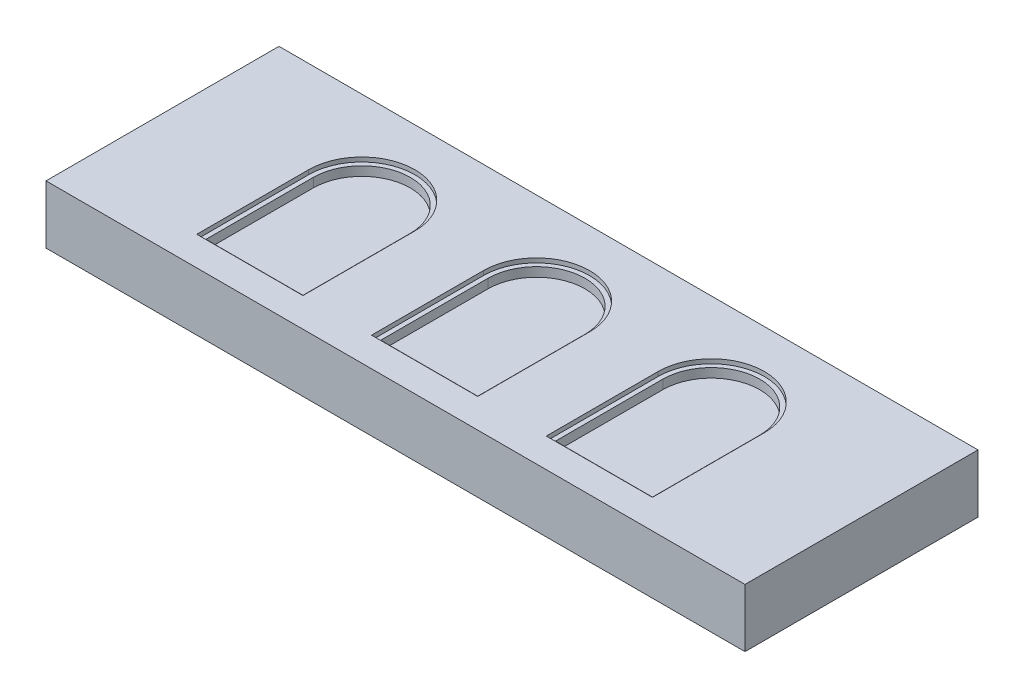
ISO-10303-21;
HEADER;
FILE_DESCRIPTION(('STEP AP214'),'2;1');
FILE_NAME('part.step','',(''),(''),'','','');
FILE_SCHEMA(('AUTOMOTIVE_DESIGN { 1 0 10303 214 1 1 1 1 }'));
ENDSEC;
DATA;
#1=APPLICATION_CONTEXT('core data for automotive mechanical design processes');
#2=APPLICATION_PROTOCOL_DEFINITION('international standard','automotive_design',2000,#1);
#3=PRODUCT_CONTEXT('',#1,'mechanical');
#4=PRODUCT('Part','Part','',(#3));
#5=PRODUCT_RELATED_PRODUCT_CATEGORY('part','',(#4));
#6=PRODUCT_DEFINITION_FORMATION('','',#4);
#7=PRODUCT_DEFINITION_CONTEXT('part definition',#1,'design');
#8=PRODUCT_DEFINITION('design','',#6,#7);
#9=PRODUCT_DEFINITION_SHAPE('','',#8);
#10=(LENGTH_UNIT() NAMED_UNIT(*) SI_UNIT(.MILLI.,.METRE.));
#11=(NAMED_UNIT(*) PLANE_ANGLE_UNIT() SI_UNIT($,.RADIAN.));
#12=(NAMED_UNIT(*) SI_UNIT($,.STERADIAN.) SOLID_ANGLE_UNIT());
#13=UNCERTAINTY_MEASURE_WITH_UNIT(LENGTH_MEASURE(1.E-05),#10,'distance_accuracy_value','');
#14=(GEOMETRIC_REPRESENTATION_CONTEXT(3) GLOBAL_UNCERTAINTY_ASSIGNED_CONTEXT((#13)) GLOBAL_UNIT_ASSIGNED_CONTEXT((#10,
#11,#12)) REPRESENTATION_CONTEXT('',''));
#15=CARTESIAN_POINT('',(0.,0.,0.));
#16=DIRECTION('',(0.,0.,1.));
#17=DIRECTION('',(1.,0.,0.));
#18=AXIS2_PLACEMENT_3D('',#15,#16,#17);
#19=CARTESIAN_POINT('',(0.,12.7,0.));
#20=DIRECTION('',(1.,0.,0.));
#21=DIRECTION('',(0.,0.,-1.));
#22=AXIS2_PLACEMENT_3D('',#19,#20,#21);
#23=PLANE('',#22);
#24=DIRECTION('',(0.,0.,1.));
#25=VECTOR('',#24,1.);
#26=CARTESIAN_POINT('',(0.,0.,0.));
#27=LINE('',#26,#25);
#28=CARTESIAN_POINT('',(0.,0.,-50.8));
#29=VERTEX_POINT('',#28);
#30=CARTESIAN_POINT('',(0.,0.,0.));
#31=VERTEX_POINT('',#30);
#32=EDGE_CURVE('E438',#29,#31,#27,.T.);
#33=ORIENTED_EDGE('',*,*,#32,.T.);
#34=DIRECTION('',(0.,-1.,0.));
#35=VECTOR('',#34,1.);
#36=CARTESIAN_POINT('',(0.,12.7,0.));
#37=LINE('',#36,#35);
#38=CARTESIAN_POINT('',(0.,12.7,0.));
#39=VERTEX_POINT('',#38);
#40=EDGE_CURVE('E12',#39,#31,#37,.T.);
#41=ORIENTED_EDGE('',*,*,#40,.F.);
#42=DIRECTION('',(0.,0.,1.));
#43=VECTOR('',#42,1.);
#44=CARTESIAN_POINT('',(0.,12.7,0.));
#45=LINE('',#44,#43);
#46=CARTESIAN_POINT('',(0.,12.7,-50.8));
#47=VERTEX_POINT('',#46);
#48=EDGE_CURVE('E455',#47,#39,#45,.T.);
#49=ORIENTED_EDGE('',*,*,#48,.F.);
#50=DIRECTION('',(0.,-1.,0.));
#51=VECTOR('',#50,1.);
#52=CARTESIAN_POINT('',(0.,12.7,-50.8));
#53=LINE('',#52,#51);
#54=EDGE_CURVE('E479',#47,#29,#53,.T.);
#55=ORIENTED_EDGE('',*,*,#54,.T.);
#56=EDGE_LOOP('',(#33,#41,#49,#55));
#57=FACE_BOUND('',#56,.T.);
#58=ADVANCED_FACE('F48',(#57),#23,.F.);
#59=CARTESIAN_POINT('',(0.,12.7,0.));
#60=DIRECTION('',(0.,0.,-1.));
#61=DIRECTION('',(-1.,0.,0.));
#62=AXIS2_PLACEMENT_3D('',#59,#60,#61);
#63=PLANE('',#62);
#64=DIRECTION('',(1.,0.,0.));
#65=VECTOR('',#64,1.);
#66=CARTESIAN_POINT('',(0.,0.,0.));
#67=LINE('',#66,#65);
#68=CARTESIAN_POINT('',(152.4,0.,0.));
#69=VERTEX_POINT('',#68);
#70=EDGE_CURVE('E483',#31,#69,#67,.T.);
#71=ORIENTED_EDGE('',*,*,#70,.T.);
#72=DIRECTION('',(0.,-1.,0.));
#73=VECTOR('',#72,1.);
#74=CARTESIAN_POINT('',(152.4,12.7,0.));
#75=LINE('',#74,#73);
#76=CARTESIAN_POINT('',(152.4,12.7,0.));
#77=VERTEX_POINT('',#76);
#78=EDGE_CURVE('E56',#77,#69,#75,.T.);
#79=ORIENTED_EDGE('',*,*,#78,.F.);
#80=DIRECTION('',(1.,0.,0.));
#81=VECTOR('',#80,1.);
#82=CARTESIAN_POINT('',(0.,12.7,0.));
#83=LINE('',#82,#81);
#84=EDGE_CURVE('E460',#39,#77,#83,.T.);
#85=ORIENTED_EDGE('',*,*,#84,.F.);
#86=ORIENTED_EDGE('',*,*,#40,.T.);
#87=EDGE_LOOP('',(#71,#79,#85,#86));
#88=FACE_BOUND('',#87,.T.);
#89=ADVANCED_FACE('F660',(#88),#63,.F.);
#90=CARTESIAN_POINT('',(152.4,12.7,0.));
#91=DIRECTION('',(-1.,0.,0.));
#92=DIRECTION('',(0.,0.,1.));
#93=AXIS2_PLACEMENT_3D('',#90,#91,#92);
#94=PLANE('',#93);
#95=DIRECTION('',(0.,0.,-1.));
#96=VECTOR('',#95,1.);
#97=CARTESIAN_POINT('',(152.4,0.,0.));
#98=LINE('',#97,#96);
#99=CARTESIAN_POINT('',(152.4,0.,-50.8));
#100=VERTEX_POINT('',#99);
#101=EDGE_CURVE('E486',#69,#100,#98,.T.);
#102=ORIENTED_EDGE('',*,*,#101,.T.);
#103=DIRECTION('',(0.,-1.,0.));
#104=VECTOR('',#103,1.);
#105=CARTESIAN_POINT('',(152.4,12.7,-50.8));
#106=LINE('',#105,#104);
#107=CARTESIAN_POINT('',(152.4,12.7,-50.8));
#108=VERTEX_POINT('',#107);
#109=EDGE_CURVE('E494',#108,#100,#106,.T.);
#110=ORIENTED_EDGE('',*,*,#109,.F.);
#111=DIRECTION('',(0.,0.,-1.));
#112=VECTOR('',#111,1.);
#113=CARTESIAN_POINT('',(152.4,12.7,0.));
#114=LINE('',#113,#112);
#115=EDGE_CURVE('E472',#77,#108,#114,.T.);
#116=ORIENTED_EDGE('',*,*,#115,.F.);
#117=ORIENTED_EDGE('',*,*,#78,.T.);
#118=EDGE_LOOP('',(#102,#110,#116,#117));
#119=FACE_BOUND('',#118,.T.);
#120=ADVANCED_FACE('F503',(#119),#94,.F.);
#121=CARTESIAN_POINT('',(0.,12.7,-50.8));
#122=DIRECTION('',(0.,0.,1.));
#123=DIRECTION('',(1.,0.,0.));
#124=AXIS2_PLACEMENT_3D('',#121,#122,#123);
#125=PLANE('',#124);
#126=DIRECTION('',(-1.,0.,0.));
#127=VECTOR('',#126,1.);
#128=CARTESIAN_POINT('',(0.,0.,-50.8));
#129=LINE('',#128,#127);
#130=EDGE_CURVE('E461',#100,#29,#129,.T.);
#131=ORIENTED_EDGE('',*,*,#130,.T.);
#132=ORIENTED_EDGE('',*,*,#54,.F.);
#133=DIRECTION('',(-1.,0.,0.));
#134=VECTOR('',#133,1.);
#135=CARTESIAN_POINT('',(0.,12.7,-50.8));
#136=LINE('',#135,#134);
#137=EDGE_CURVE('E475',#108,#47,#136,.T.);
#138=ORIENTED_EDGE('',*,*,#137,.F.);
#139=ORIENTED_EDGE('',*,*,#109,.T.);
#140=EDGE_LOOP('',(#131,#132,#138,#139));
#141=FACE_BOUND('',#140,.T.);
#142=ADVANCED_FACE('F512',(#141),#125,.F.);
#143=CARTESIAN_POINT('',(0.,12.7,0.));
#144=DIRECTION('',(0.,-1.,0.));
#145=DIRECTION('',(0.,0.,-1.));
#146=AXIS2_PLACEMENT_3D('',#143,#144,#145);
#147=PLANE('',#146);
#148=DIRECTION('',(0.,0.,1.));
#149=VECTOR('',#148,1.);
#150=CARTESIAN_POINT('',(102.726998,12.7,-30.75));
#151=LINE('',#150,#149);
#152=CARTESIAN_POINT('',(102.726998,12.7,-30.75));
#153=VERTEX_POINT('',#152);
#154=CARTESIAN_POINT('',(102.726998,12.7,-6.35));
#155=VERTEX_POINT('',#154);
#156=EDGE_CURVE('E249',#153,#155,#151,.T.);
#157=ORIENTED_EDGE('',*,*,#156,.F.);
#158=CARTESIAN_POINT('',(114.3,12.7,-30.75));
#159=DIRECTION('',(0.,1.,0.));
#160=DIRECTION('',(0.,0.,1.));
#161=AXIS2_PLACEMENT_3D('',#158,#159,#160);
#162=CIRCLE('',#161,11.573002);
#163=CARTESIAN_POINT('',(125.873002,12.7,-30.75));
#164=VERTEX_POINT('',#163);
#165=EDGE_CURVE('E63',#164,#153,#162,.T.);
#166=ORIENTED_EDGE('',*,*,#165,.F.);
#167=DIRECTION('',(0.,0.,-1.));
#168=VECTOR('',#167,1.);
#169=CARTESIAN_POINT('',(125.873002,12.7,-6.35));
#170=LINE('',#169,#168);
#171=CARTESIAN_POINT('',(125.873002,12.7,-6.35));
#172=VERTEX_POINT('',#171);
#173=EDGE_CURVE('E583',#172,#164,#170,.T.);
#174=ORIENTED_EDGE('',*,*,#173,.F.);
#175=DIRECTION('',(1.,0.,0.));
#176=VECTOR('',#175,1.);
#177=CARTESIAN_POINT('',(102.726998,12.7,-6.35));
#178=LINE('',#177,#176);
#179=EDGE_CURVE('E587',#155,#172,#178,.T.);
#180=ORIENTED_EDGE('',*,*,#179,.F.);
#181=EDGE_LOOP('',(#157,#166,#174,#180));
#182=FACE_BOUND('',#181,.T.);
#183=DIRECTION('',(0.,0.,1.));
#184=VECTOR('',#183,1.);
#185=CARTESIAN_POINT('',(26.526998,12.7,-30.75));
#186=LINE('',#185,#184);
#187=CARTESIAN_POINT('',(26.526998,12.7,-30.75));
#188=VERTEX_POINT('',#187);
#189=CARTESIAN_POINT('',(26.526998,12.7,-6.35));
#190=VERTEX_POINT('',#189);
#191=EDGE_CURVE('E543',#188,#190,#186,.T.);
#192=ORIENTED_EDGE('',*,*,#191,.F.);
#193=CARTESIAN_POINT('',(38.1,12.7,-30.75));
#194=DIRECTION('',(0.,1.,0.));
#195=DIRECTION('',(0.,0.,1.));
#196=AXIS2_PLACEMENT_3D('',#193,#194,#195);
#197=CIRCLE('',#196,11.573002);
#198=CARTESIAN_POINT('',(49.673002,12.7,-30.75));
#199=VERTEX_POINT('',#198);
#200=EDGE_CURVE('E71',#199,#188,#197,.T.);
#201=ORIENTED_EDGE('',*,*,#200,.F.);
#202=DIRECTION('',(0.,0.,-1.));
#203=VECTOR('',#202,1.);
#204=CARTESIAN_POINT('',(49.673002,12.7,-6.35));
#205=LINE('',#204,#203);
#206=CARTESIAN_POINT('',(49.673002,12.7,-6.35));
#207=VERTEX_POINT('',#206);
#208=EDGE_CURVE('E558',#207,#199,#205,.T.);
#209=ORIENTED_EDGE('',*,*,#208,.F.);
#210=DIRECTION('',(1.,0.,0.));
#211=VECTOR('',#210,1.);
#212=CARTESIAN_POINT('',(26.526998,12.7,-6.35));
#213=LINE('',#212,#211);
#214=EDGE_CURVE('E561',#190,#207,#213,.T.);
#215=ORIENTED_EDGE('',*,*,#214,.F.);
#216=EDGE_LOOP('',(#192,#201,#209,#215));
#217=FACE_BOUND('',#216,.T.);
#218=DIRECTION('',(0.,0.,1.));
#219=VECTOR('',#218,1.);
#220=CARTESIAN_POINT('',(64.626998,12.7,-30.75));
#221=LINE('',#220,#219);
#222=CARTESIAN_POINT('',(64.626998,12.7,-30.75));
#223=VERTEX_POINT('',#222);
#224=CARTESIAN_POINT('',(64.626998,12.7,-6.35));
#225=VERTEX_POINT('',#224);
#226=EDGE_CURVE('E420',#223,#225,#221,.T.);
#227=ORIENTED_EDGE('',*,*,#226,.F.);
#228=CARTESIAN_POINT('',(76.2,12.7,-30.75));
#229=DIRECTION('',(0.,1.,0.));
#230=DIRECTION('',(0.,0.,1.));
#231=AXIS2_PLACEMENT_3D('',#228,#229,#230);
#232=CIRCLE('',#231,11.573002);
#233=CARTESIAN_POINT('',(87.773002,12.7,-30.75));
#234=VERTEX_POINT('',#233);
#235=EDGE_CURVE('E377',#234,#223,#232,.T.);
#236=ORIENTED_EDGE('',*,*,#235,.F.);
#237=DIRECTION('',(0.,0.,-1.));
#238=VECTOR('',#237,1.);
#239=CARTESIAN_POINT('',(87.773002,12.7,-6.35));
#240=LINE('',#239,#238);
#241=CARTESIAN_POINT('',(87.773002,12.7,-6.35));
#242=VERTEX_POINT('',#241);
#243=EDGE_CURVE('E399',#242,#234,#240,.T.);
#244=ORIENTED_EDGE('',*,*,#243,.F.);
#245=DIRECTION('',(1.,0.,0.));
#246=VECTOR('',#245,1.);
#247=CARTESIAN_POINT('',(64.626998,12.7,-6.35));
#248=LINE('',#247,#246);
#249=EDGE_CURVE('E432',#225,#242,#248,.T.);
#250=ORIENTED_EDGE('',*,*,#249,.F.);
#251=EDGE_LOOP('',(#227,#236,#244,#250));
#252=FACE_BOUND('',#251,.T.);
#253=ORIENTED_EDGE('',*,*,#48,.T.);
#254=ORIENTED_EDGE('',*,*,#84,.T.);
#255=ORIENTED_EDGE('',*,*,#115,.T.);
#256=ORIENTED_EDGE('',*,*,#137,.T.);
#257=EDGE_LOOP('',(#253,#254,#255,#256));
#258=FACE_BOUND('',#257,.T.);
#259=ADVANCED_FACE('F518',(#182,#217,#252,#258),#147,.F.);
#260=CARTESIAN_POINT('',(0.,0.,0.));
#261=DIRECTION('',(0.,-1.,0.));
#262=DIRECTION('',(0.,0.,-1.));
#263=AXIS2_PLACEMENT_3D('',#260,#261,#262);
#264=PLANE('',#263);
#265=ORIENTED_EDGE('',*,*,#32,.F.);
#266=ORIENTED_EDGE('',*,*,#130,.F.);
#267=ORIENTED_EDGE('',*,*,#101,.F.);
#268=ORIENTED_EDGE('',*,*,#70,.F.);
#269=EDGE_LOOP('',(#265,#266,#267,#268));
#270=FACE_BOUND('',#269,.T.);
#271=ADVANCED_FACE('F509',(#270),#264,.T.);
#272=CARTESIAN_POINT('',(76.2,11.75,-30.75));
#273=DIRECTION('',(0.,1.,0.));
#274=DIRECTION('',(0.,0.,1.));
#275=AXIS2_PLACEMENT_3D('',#272,#273,#274);
#276=CYLINDRICAL_SURFACE('',#275,11.573002);
#277=ORIENTED_EDGE('',*,*,#235,.T.);
#278=DIRECTION('',(0.,1.,0.));
#279=VECTOR('',#278,1.);
#280=CARTESIAN_POINT('',(64.626998,11.75,-30.75));
#281=LINE('',#280,#279);
#282=CARTESIAN_POINT('',(64.626998,11.75,-30.75));
#283=VERTEX_POINT('',#282);
#284=EDGE_CURVE('E415',#283,#223,#281,.T.);
#285=ORIENTED_EDGE('',*,*,#284,.F.);
#286=CARTESIAN_POINT('',(76.2,11.75,-30.75));
#287=DIRECTION('',(0.,1.,0.));
#288=DIRECTION('',(0.,0.,1.));
#289=AXIS2_PLACEMENT_3D('',#286,#287,#288);
#290=CIRCLE('',#289,11.573002);
#291=CARTESIAN_POINT('',(87.773002,11.75,-30.75));
#292=VERTEX_POINT('',#291);
#293=EDGE_CURVE('E393',#292,#283,#290,.T.);
#294=ORIENTED_EDGE('',*,*,#293,.F.);
#295=DIRECTION('',(0.,1.,0.));
#296=VECTOR('',#295,1.);
#297=CARTESIAN_POINT('',(87.773002,11.75,-30.75));
#298=LINE('',#297,#296);
#299=EDGE_CURVE('E434',#292,#234,#298,.T.);
#300=ORIENTED_EDGE('',*,*,#299,.T.);
#301=EDGE_LOOP('',(#277,#285,#294,#300));
#302=FACE_BOUND('',#301,.T.);
#303=ADVANCED_FACE('F673',(#302),#276,.F.);
#304=CARTESIAN_POINT('',(87.773002,11.75,-6.35));
#305=DIRECTION('',(1.,0.,0.));
#306=DIRECTION('',(0.,0.,-1.));
#307=AXIS2_PLACEMENT_3D('',#304,#305,#306);
#308=PLANE('',#307);
#309=ORIENTED_EDGE('',*,*,#243,.T.);
#310=ORIENTED_EDGE('',*,*,#299,.F.);
#311=DIRECTION('',(0.,0.,-1.));
#312=VECTOR('',#311,1.);
#313=CARTESIAN_POINT('',(87.773002,11.75,-6.35));
#314=LINE('',#313,#312);
#315=CARTESIAN_POINT('',(87.773002,11.75,-6.35));
#316=VERTEX_POINT('',#315);
#317=EDGE_CURVE('E410',#316,#292,#314,.T.);
#318=ORIENTED_EDGE('',*,*,#317,.F.);
#319=DIRECTION('',(0.,1.,0.));
#320=VECTOR('',#319,1.);
#321=CARTESIAN_POINT('',(87.773002,11.75,-6.35));
#322=LINE('',#321,#320);
#323=EDGE_CURVE('E439',#316,#242,#322,.T.);
#324=ORIENTED_EDGE('',*,*,#323,.T.);
#325=EDGE_LOOP('',(#309,#310,#318,#324));
#326=FACE_BOUND('',#325,.T.);
#327=ADVANCED_FACE('F679',(#326),#308,.F.);
#328=CARTESIAN_POINT('',(64.626998,11.75,-6.35));
#329=DIRECTION('',(0.,0.,1.));
#330=DIRECTION('',(1.,0.,0.));
#331=AXIS2_PLACEMENT_3D('',#328,#329,#330);
#332=PLANE('',#331);
#333=ORIENTED_EDGE('',*,*,#249,.T.);
#334=ORIENTED_EDGE('',*,*,#323,.F.);
#335=DIRECTION('',(1.,0.,0.));
#336=VECTOR('',#335,1.);
#337=CARTESIAN_POINT('',(64.626998,11.75,-6.35));
#338=LINE('',#337,#336);
#339=CARTESIAN_POINT('',(64.626998,11.75,-6.35));
#340=VERTEX_POINT('',#339);
#341=EDGE_CURVE('E416',#340,#316,#338,.T.);
#342=ORIENTED_EDGE('',*,*,#341,.F.);
#343=DIRECTION('',(0.,1.,0.));
#344=VECTOR('',#343,1.);
#345=CARTESIAN_POINT('',(64.626998,11.75,-6.35));
#346=LINE('',#345,#344);
#347=EDGE_CURVE('E448',#340,#225,#346,.T.);
#348=ORIENTED_EDGE('',*,*,#347,.T.);
#349=EDGE_LOOP('',(#333,#334,#342,#348));
#350=FACE_BOUND('',#349,.T.);
#351=ADVANCED_FACE('F622',(#350),#332,.F.);
#352=CARTESIAN_POINT('',(64.626998,11.75,-30.75));
#353=DIRECTION('',(-1.,0.,0.));
#354=DIRECTION('',(0.,0.,1.));
#355=AXIS2_PLACEMENT_3D('',#352,#353,#354);
#356=PLANE('',#355);
#357=ORIENTED_EDGE('',*,*,#226,.T.);
#358=ORIENTED_EDGE('',*,*,#347,.F.);
#359=DIRECTION('',(0.,0.,1.));
#360=VECTOR('',#359,1.);
#361=CARTESIAN_POINT('',(64.626998,11.75,-30.75));
#362=LINE('',#361,#360);
#363=EDGE_CURVE('E398',#283,#340,#362,.T.);
#364=ORIENTED_EDGE('',*,*,#363,.F.);
#365=ORIENTED_EDGE('',*,*,#284,.T.);
#366=EDGE_LOOP('',(#357,#358,#364,#365));
#367=FACE_BOUND('',#366,.T.);
#368=ADVANCED_FACE('F618',(#367),#356,.F.);
#369=CARTESIAN_POINT('',(76.2,11.75,-30.75));
#370=DIRECTION('',(0.,1.,0.));
#371=DIRECTION('',(0.,0.,1.));
#372=AXIS2_PLACEMENT_3D('',#369,#370,#371);
#373=PLANE('',#372);
#374=CARTESIAN_POINT('',(76.2,11.75,-30.75));
#375=DIRECTION('',(0.,1.,0.));
#376=DIRECTION('',(0.,0.,1.));
#377=AXIS2_PLACEMENT_3D('',#374,#375,#376);
#378=CIRCLE('',#377,10.573002);
#379=CARTESIAN_POINT('',(86.773002,11.75,-30.75));
#380=VERTEX_POINT('',#379);
#381=CARTESIAN_POINT('',(65.626998,11.75,-30.75));
#382=VERTEX_POINT('',#381);
#383=EDGE_CURVE('E353',#380,#382,#378,.T.);
#384=ORIENTED_EDGE('',*,*,#383,.F.);
#385=DIRECTION('',(0.,0.,-1.));
#386=VECTOR('',#385,1.);
#387=CARTESIAN_POINT('',(86.773002,11.75,-7.35));
#388=LINE('',#387,#386);
#389=CARTESIAN_POINT('',(86.773002,11.75,-7.35));
#390=VERTEX_POINT('',#389);
#391=EDGE_CURVE('E335',#390,#380,#388,.T.);
#392=ORIENTED_EDGE('',*,*,#391,.F.);
#393=DIRECTION('',(1.,0.,0.));
#394=VECTOR('',#393,1.);
#395=CARTESIAN_POINT('',(65.626998,11.75,-7.35));
#396=LINE('',#395,#394);
#397=CARTESIAN_POINT('',(65.626998,11.75,-7.35));
#398=VERTEX_POINT('',#397);
#399=EDGE_CURVE('E366',#398,#390,#396,.T.);
#400=ORIENTED_EDGE('',*,*,#399,.F.);
#401=DIRECTION('',(0.,0.,1.));
#402=VECTOR('',#401,1.);
#403=CARTESIAN_POINT('',(65.626998,11.75,-30.75));
#404=LINE('',#403,#402);
#405=EDGE_CURVE('E358',#382,#398,#404,.T.);
#406=ORIENTED_EDGE('',*,*,#405,.F.);
#407=EDGE_LOOP('',(#384,#392,#400,#406));
#408=FACE_BOUND('',#407,.T.);
#409=ORIENTED_EDGE('',*,*,#293,.T.);
#410=ORIENTED_EDGE('',*,*,#363,.T.);
#411=ORIENTED_EDGE('',*,*,#341,.T.);
#412=ORIENTED_EDGE('',*,*,#317,.T.);
#413=EDGE_LOOP('',(#409,#410,#411,#412));
#414=FACE_BOUND('',#413,.T.);
#415=ADVANCED_FACE('F613',(#408,#414),#373,.T.);
#416=CARTESIAN_POINT('',(76.2,9.75,-30.75));
#417=DIRECTION('',(0.,1.,0.));
#418=DIRECTION('',(0.,0.,1.));
#419=AXIS2_PLACEMENT_3D('',#416,#417,#418);
#420=CYLINDRICAL_SURFACE('',#419,10.573002);
#421=ORIENTED_EDGE('',*,*,#383,.T.);
#422=DIRECTION('',(0.,1.,0.));
#423=VECTOR('',#422,1.);
#424=CARTESIAN_POINT('',(65.626998,9.75,-30.75));
#425=LINE('',#424,#423);
#426=CARTESIAN_POINT('',(65.626998,9.75,-30.75));
#427=VERTEX_POINT('',#426);
#428=EDGE_CURVE('E352',#427,#382,#425,.T.);
#429=ORIENTED_EDGE('',*,*,#428,.F.);
#430=CARTESIAN_POINT('',(76.2,9.75,-30.75));
#431=DIRECTION('',(0.,1.,0.));
#432=DIRECTION('',(0.,0.,1.));
#433=AXIS2_PLACEMENT_3D('',#430,#431,#432);
#434=CIRCLE('',#433,10.573002);
#435=CARTESIAN_POINT('',(86.773002,9.75,-30.75));
#436=VERTEX_POINT('',#435);
#437=EDGE_CURVE('E329',#436,#427,#434,.T.);
#438=ORIENTED_EDGE('',*,*,#437,.F.);
#439=DIRECTION('',(0.,1.,0.));
#440=VECTOR('',#439,1.);
#441=CARTESIAN_POINT('',(86.773002,9.75,-30.75));
#442=LINE('',#441,#440);
#443=EDGE_CURVE('E373',#436,#380,#442,.T.);
#444=ORIENTED_EDGE('',*,*,#443,.T.);
#445=EDGE_LOOP('',(#421,#429,#438,#444));
#446=FACE_BOUND('',#445,.T.);
#447=ADVANCED_FACE('F689',(#446),#420,.F.);
#448=CARTESIAN_POINT('',(86.773002,9.75,-7.35));
#449=DIRECTION('',(1.,0.,0.));
#450=DIRECTION('',(0.,0.,-1.));
#451=AXIS2_PLACEMENT_3D('',#448,#449,#450);
#452=PLANE('',#451);
#453=ORIENTED_EDGE('',*,*,#391,.T.);
#454=ORIENTED_EDGE('',*,*,#443,.F.);
#455=DIRECTION('',(0.,0.,-1.));
#456=VECTOR('',#455,1.);
#457=CARTESIAN_POINT('',(86.773002,9.75,-7.35));
#458=LINE('',#457,#456);
#459=CARTESIAN_POINT('',(86.773002,9.75,-7.35));
#460=VERTEX_POINT('',#459);
#461=EDGE_CURVE('E347',#460,#436,#458,.T.);
#462=ORIENTED_EDGE('',*,*,#461,.F.);
#463=DIRECTION('',(0.,1.,0.));
#464=VECTOR('',#463,1.);
#465=CARTESIAN_POINT('',(86.773002,9.75,-7.35));
#466=LINE('',#465,#464);
#467=EDGE_CURVE('E378',#460,#390,#466,.T.);
#468=ORIENTED_EDGE('',*,*,#467,.T.);
#469=EDGE_LOOP('',(#453,#454,#462,#468));
#470=FACE_BOUND('',#469,.T.);
#471=ADVANCED_FACE('F693',(#470),#452,.F.);
#472=CARTESIAN_POINT('',(65.626998,9.75,-7.35));
#473=DIRECTION('',(0.,0.,1.));
#474=DIRECTION('',(1.,0.,0.));
#475=AXIS2_PLACEMENT_3D('',#472,#473,#474);
#476=PLANE('',#475);
#477=ORIENTED_EDGE('',*,*,#399,.T.);
#478=ORIENTED_EDGE('',*,*,#467,.F.);
#479=DIRECTION('',(1.,0.,0.));
#480=VECTOR('',#479,1.);
#481=CARTESIAN_POINT('',(65.626998,9.75,-7.35));
#482=LINE('',#481,#480);
#483=CARTESIAN_POINT('',(65.626998,9.75,-7.35));
#484=VERTEX_POINT('',#483);
#485=EDGE_CURVE('E343',#484,#460,#482,.T.);
#486=ORIENTED_EDGE('',*,*,#485,.F.);
#487=DIRECTION('',(0.,1.,0.));
#488=VECTOR('',#487,1.);
#489=CARTESIAN_POINT('',(65.626998,9.75,-7.35));
#490=LINE('',#489,#488);
#491=EDGE_CURVE('E387',#484,#398,#490,.T.);
#492=ORIENTED_EDGE('',*,*,#491,.T.);
#493=EDGE_LOOP('',(#477,#478,#486,#492));
#494=FACE_BOUND('',#493,.T.);
#495=ADVANCED_FACE('F699',(#494),#476,.F.);
#496=CARTESIAN_POINT('',(65.626998,9.75,-30.75));
#497=DIRECTION('',(-1.,0.,0.));
#498=DIRECTION('',(0.,0.,1.));
#499=AXIS2_PLACEMENT_3D('',#496,#497,#498);
#500=PLANE('',#499);
#501=ORIENTED_EDGE('',*,*,#405,.T.);
#502=ORIENTED_EDGE('',*,*,#491,.F.);
#503=DIRECTION('',(0.,0.,1.));
#504=VECTOR('',#503,1.);
#505=CARTESIAN_POINT('',(65.626998,9.75,-30.75));
#506=LINE('',#505,#504);
#507=EDGE_CURVE('E334',#427,#484,#506,.T.);
#508=ORIENTED_EDGE('',*,*,#507,.F.);
#509=ORIENTED_EDGE('',*,*,#428,.T.);
#510=EDGE_LOOP('',(#501,#502,#508,#509));
#511=FACE_BOUND('',#510,.T.);
#512=ADVANCED_FACE('F695',(#511),#500,.F.);
#513=CARTESIAN_POINT('',(76.2,9.75,-30.75));
#514=DIRECTION('',(0.,1.,0.));
#515=DIRECTION('',(0.,0.,1.));
#516=AXIS2_PLACEMENT_3D('',#513,#514,#515);
#517=PLANE('',#516);
#518=ORIENTED_EDGE('',*,*,#437,.T.);
#519=ORIENTED_EDGE('',*,*,#507,.T.);
#520=ORIENTED_EDGE('',*,*,#485,.T.);
#521=ORIENTED_EDGE('',*,*,#461,.T.);
#522=EDGE_LOOP('',(#518,#519,#520,#521));
#523=FACE_BOUND('',#522,.T.);
#524=ADVANCED_FACE('F698',(#523),#517,.T.);
#525=CARTESIAN_POINT('',(38.1,11.75,-30.75));
#526=DIRECTION('',(0.,1.,0.));
#527=DIRECTION('',(0.,0.,1.));
#528=AXIS2_PLACEMENT_3D('',#525,#526,#527);
#529=CYLINDRICAL_SURFACE('',#528,11.573002);
#530=ORIENTED_EDGE('',*,*,#200,.T.);
#531=DIRECTION('',(0.,1.,0.));
#532=VECTOR('',#531,1.);
#533=CARTESIAN_POINT('',(26.526998,11.75,-30.75));
#534=LINE('',#533,#532);
#535=CARTESIAN_POINT('',(26.526998,11.75,-30.75));
#536=VERTEX_POINT('',#535);
#537=EDGE_CURVE('E563',#536,#188,#534,.T.);
#538=ORIENTED_EDGE('',*,*,#537,.F.);
#539=CARTESIAN_POINT('',(38.1,11.75,-30.75));
#540=DIRECTION('',(0.,1.,0.));
#541=DIRECTION('',(0.,0.,1.));
#542=AXIS2_PLACEMENT_3D('',#539,#540,#541);
#543=CIRCLE('',#542,11.573002);
#544=CARTESIAN_POINT('',(49.673002,11.75,-30.75));
#545=VERTEX_POINT('',#544);
#546=EDGE_CURVE('E524',#545,#536,#543,.T.);
#547=ORIENTED_EDGE('',*,*,#546,.F.);
#548=DIRECTION('',(0.,1.,0.));
#549=VECTOR('',#548,1.);
#550=CARTESIAN_POINT('',(49.673002,11.75,-30.75));
#551=LINE('',#550,#549);
#552=EDGE_CURVE('E327',#545,#199,#551,.T.);
#553=ORIENTED_EDGE('',*,*,#552,.T.);
#554=EDGE_LOOP('',(#530,#538,#547,#553));
#555=FACE_BOUND('',#554,.T.);
#556=ADVANCED_FACE('F709',(#555),#529,.F.);
#557=CARTESIAN_POINT('',(49.673002,11.75,-6.35));
#558=DIRECTION('',(1.,0.,0.));
#559=DIRECTION('',(0.,0.,-1.));
#560=AXIS2_PLACEMENT_3D('',#557,#558,#559);
#561=PLANE('',#560);
#562=ORIENTED_EDGE('',*,*,#208,.T.);
#563=ORIENTED_EDGE('',*,*,#552,.F.);
#564=DIRECTION('',(0.,0.,-1.));
#565=VECTOR('',#564,1.);
#566=CARTESIAN_POINT('',(49.673002,11.75,-6.35));
#567=LINE('',#566,#565);
#568=CARTESIAN_POINT('',(49.673002,11.75,-6.35));
#569=VERTEX_POINT('',#568);
#570=EDGE_CURVE('E570',#569,#545,#567,.T.);
#571=ORIENTED_EDGE('',*,*,#570,.F.);
#572=DIRECTION('',(0.,1.,0.));
#573=VECTOR('',#572,1.);
#574=CARTESIAN_POINT('',(49.673002,11.75,-6.35));
#575=LINE('',#574,#573);
#576=EDGE_CURVE('E560',#569,#207,#575,.T.);
#577=ORIENTED_EDGE('',*,*,#576,.T.);
#578=EDGE_LOOP('',(#562,#563,#571,#577));
#579=FACE_BOUND('',#578,.T.);
#580=ADVANCED_FACE('F713',(#579),#561,.F.);
#581=CARTESIAN_POINT('',(26.526998,11.75,-6.35));
#582=DIRECTION('',(0.,0.,1.));
#583=DIRECTION('',(1.,0.,0.));
#584=AXIS2_PLACEMENT_3D('',#581,#582,#583);
#585=PLANE('',#584);
#586=ORIENTED_EDGE('',*,*,#214,.T.);
#587=ORIENTED_EDGE('',*,*,#576,.F.);
#588=DIRECTION('',(1.,0.,0.));
#589=VECTOR('',#588,1.);
#590=CARTESIAN_POINT('',(26.526998,11.75,-6.35));
#591=LINE('',#590,#589);
#592=CARTESIAN_POINT('',(26.526998,11.75,-6.35));
#593=VERTEX_POINT('',#592);
#594=EDGE_CURVE('E574',#593,#569,#591,.T.);
#595=ORIENTED_EDGE('',*,*,#594,.F.);
#596=DIRECTION('',(0.,1.,0.));
#597=VECTOR('',#596,1.);
#598=CARTESIAN_POINT('',(26.526998,11.75,-6.35));
#599=LINE('',#598,#597);
#600=EDGE_CURVE('E573',#593,#190,#599,.T.);
#601=ORIENTED_EDGE('',*,*,#600,.T.);
#602=EDGE_LOOP('',(#586,#587,#595,#601));
#603=FACE_BOUND('',#602,.T.);
#604=ADVANCED_FACE('F716',(#603),#585,.F.);
#605=CARTESIAN_POINT('',(26.526998,11.75,-30.75));
#606=DIRECTION('',(-1.,0.,0.));
#607=DIRECTION('',(0.,0.,1.));
#608=AXIS2_PLACEMENT_3D('',#605,#606,#607);
#609=PLANE('',#608);
#610=ORIENTED_EDGE('',*,*,#191,.T.);
#611=ORIENTED_EDGE('',*,*,#600,.F.);
#612=DIRECTION('',(0.,0.,1.));
#613=VECTOR('',#612,1.);
#614=CARTESIAN_POINT('',(26.526998,11.75,-30.75));
#615=LINE('',#614,#613);
#616=EDGE_CURVE('E568',#536,#593,#615,.T.);
#617=ORIENTED_EDGE('',*,*,#616,.F.);
#618=ORIENTED_EDGE('',*,*,#537,.T.);
#619=EDGE_LOOP('',(#610,#611,#617,#618));
#620=FACE_BOUND('',#619,.T.);
#621=ADVANCED_FACE('F720',(#620),#609,.F.);
#622=CARTESIAN_POINT('',(38.1,11.75,-30.75));
#623=DIRECTION('',(0.,1.,0.));
#624=DIRECTION('',(0.,0.,1.));
#625=AXIS2_PLACEMENT_3D('',#622,#623,#624);
#626=PLANE('',#625);
#627=CARTESIAN_POINT('',(38.1,11.75,-30.75));
#628=DIRECTION('',(0.,1.,0.));
#629=DIRECTION('',(0.,0.,1.));
#630=AXIS2_PLACEMENT_3D('',#627,#628,#629);
#631=CIRCLE('',#630,10.573002);
#632=CARTESIAN_POINT('',(48.673002,11.75,-30.75));
#633=VERTEX_POINT('',#632);
#634=CARTESIAN_POINT('',(27.526998,11.75,-30.75));
#635=VERTEX_POINT('',#634);
#636=EDGE_CURVE('E521',#633,#635,#631,.T.);
#637=ORIENTED_EDGE('',*,*,#636,.F.);
#638=DIRECTION('',(0.,0.,-1.));
#639=VECTOR('',#638,1.);
#640=CARTESIAN_POINT('',(48.673002,11.75,-7.35));
#641=LINE('',#640,#639);
#642=CARTESIAN_POINT('',(48.673002,11.75,-7.35));
#643=VERTEX_POINT('',#642);
#644=EDGE_CURVE('E537',#643,#633,#641,.T.);
#645=ORIENTED_EDGE('',*,*,#644,.F.);
#646=DIRECTION('',(1.,0.,0.));
#647=VECTOR('',#646,1.);
#648=CARTESIAN_POINT('',(27.526998,11.75,-7.35));
#649=LINE('',#648,#647);
#650=CARTESIAN_POINT('',(27.526998,11.75,-7.35));
#651=VERTEX_POINT('',#650);
#652=EDGE_CURVE('E532',#651,#643,#649,.T.);
#653=ORIENTED_EDGE('',*,*,#652,.F.);
#654=DIRECTION('',(0.,0.,1.));
#655=VECTOR('',#654,1.);
#656=CARTESIAN_POINT('',(27.526998,11.75,-30.75));
#657=LINE('',#656,#655);
#658=EDGE_CURVE('E527',#635,#651,#657,.T.);
#659=ORIENTED_EDGE('',*,*,#658,.F.);
#660=EDGE_LOOP('',(#637,#645,#653,#659));
#661=FACE_BOUND('',#660,.T.);
#662=ORIENTED_EDGE('',*,*,#546,.T.);
#663=ORIENTED_EDGE('',*,*,#616,.T.);
#664=ORIENTED_EDGE('',*,*,#594,.T.);
#665=ORIENTED_EDGE('',*,*,#570,.T.);
#666=EDGE_LOOP('',(#662,#663,#664,#665));
#667=FACE_BOUND('',#666,.T.);
#668=ADVANCED_FACE('F724',(#661,#667),#626,.T.);
#669=CARTESIAN_POINT('',(38.1,9.75,-30.75));
#670=DIRECTION('',(0.,1.,0.));
#671=DIRECTION('',(0.,0.,1.));
#672=AXIS2_PLACEMENT_3D('',#669,#670,#671);
#673=CYLINDRICAL_SURFACE('',#672,10.573002);
#674=ORIENTED_EDGE('',*,*,#636,.T.);
#675=DIRECTION('',(0.,1.,0.));
#676=VECTOR('',#675,1.);
#677=CARTESIAN_POINT('',(27.526998,9.75,-30.75));
#678=LINE('',#677,#676);
#679=CARTESIAN_POINT('',(27.526998,9.75,-30.75));
#680=VERTEX_POINT('',#679);
#681=EDGE_CURVE('E535',#680,#635,#678,.T.);
#682=ORIENTED_EDGE('',*,*,#681,.F.);
#683=CARTESIAN_POINT('',(38.1,9.75,-30.75));
#684=DIRECTION('',(0.,1.,0.));
#685=DIRECTION('',(0.,0.,1.));
#686=AXIS2_PLACEMENT_3D('',#683,#684,#685);
#687=CIRCLE('',#686,10.573002);
#688=CARTESIAN_POINT('',(48.673002,9.75,-30.75));
#689=VERTEX_POINT('',#688);
#690=EDGE_CURVE('E540',#689,#680,#687,.T.);
#691=ORIENTED_EDGE('',*,*,#690,.F.);
#692=DIRECTION('',(0.,1.,0.));
#693=VECTOR('',#692,1.);
#694=CARTESIAN_POINT('',(48.673002,9.75,-30.75));
#695=LINE('',#694,#693);
#696=EDGE_CURVE('E525',#689,#633,#695,.T.);
#697=ORIENTED_EDGE('',*,*,#696,.T.);
#698=EDGE_LOOP('',(#674,#682,#691,#697));
#699=FACE_BOUND('',#698,.T.);
#700=ADVANCED_FACE('F728',(#699),#673,.F.);
#701=CARTESIAN_POINT('',(48.673002,9.75,-7.35));
#702=DIRECTION('',(1.,0.,0.));
#703=DIRECTION('',(0.,0.,-1.));
#704=AXIS2_PLACEMENT_3D('',#701,#702,#703);
#705=PLANE('',#704);
#706=ORIENTED_EDGE('',*,*,#644,.T.);
#707=ORIENTED_EDGE('',*,*,#696,.F.);
#708=DIRECTION('',(0.,0.,-1.));
#709=VECTOR('',#708,1.);
#710=CARTESIAN_POINT('',(48.673002,9.75,-7.35));
#711=LINE('',#710,#709);
#712=CARTESIAN_POINT('',(48.673002,9.75,-7.35));
#713=VERTEX_POINT('',#712);
#714=EDGE_CURVE('E530',#713,#689,#711,.T.);
#715=ORIENTED_EDGE('',*,*,#714,.F.);
#716=DIRECTION('',(0.,1.,0.));
#717=VECTOR('',#716,1.);
#718=CARTESIAN_POINT('',(48.673002,9.75,-7.35));
#719=LINE('',#718,#717);
#720=EDGE_CURVE('E534',#713,#643,#719,.T.);
#721=ORIENTED_EDGE('',*,*,#720,.T.);
#722=EDGE_LOOP('',(#706,#707,#715,#721));
#723=FACE_BOUND('',#722,.T.);
#724=ADVANCED_FACE('F732',(#723),#705,.F.);
#725=CARTESIAN_POINT('',(27.526998,9.75,-7.35));
#726=DIRECTION('',(0.,0.,1.));
#727=DIRECTION('',(1.,0.,0.));
#728=AXIS2_PLACEMENT_3D('',#725,#726,#727);
#729=PLANE('',#728);
#730=ORIENTED_EDGE('',*,*,#652,.T.);
#731=ORIENTED_EDGE('',*,*,#720,.F.);
#732=DIRECTION('',(1.,0.,0.));
#733=VECTOR('',#732,1.);
#734=CARTESIAN_POINT('',(27.526998,9.75,-7.35));
#735=LINE('',#734,#733);
#736=CARTESIAN_POINT('',(27.526998,9.75,-7.35));
#737=VERTEX_POINT('',#736);
#738=EDGE_CURVE('E546',#737,#713,#735,.T.);
#739=ORIENTED_EDGE('',*,*,#738,.F.);
#740=DIRECTION('',(0.,1.,0.));
#741=VECTOR('',#740,1.);
#742=CARTESIAN_POINT('',(27.526998,9.75,-7.35));
#743=LINE('',#742,#741);
#744=EDGE_CURVE('E529',#737,#651,#743,.T.);
#745=ORIENTED_EDGE('',*,*,#744,.T.);
#746=EDGE_LOOP('',(#730,#731,#739,#745));
#747=FACE_BOUND('',#746,.T.);
#748=ADVANCED_FACE('F736',(#747),#729,.F.);
#749=CARTESIAN_POINT('',(27.526998,9.75,-30.75));
#750=DIRECTION('',(-1.,0.,0.));
#751=DIRECTION('',(0.,0.,1.));
#752=AXIS2_PLACEMENT_3D('',#749,#750,#751);
#753=PLANE('',#752);
#754=ORIENTED_EDGE('',*,*,#658,.T.);
#755=ORIENTED_EDGE('',*,*,#744,.F.);
#756=DIRECTION('',(0.,0.,1.));
#757=VECTOR('',#756,1.);
#758=CARTESIAN_POINT('',(27.526998,9.75,-30.75));
#759=LINE('',#758,#757);
#760=EDGE_CURVE('E542',#680,#737,#759,.T.);
#761=ORIENTED_EDGE('',*,*,#760,.F.);
#762=ORIENTED_EDGE('',*,*,#681,.T.);
#763=EDGE_LOOP('',(#754,#755,#761,#762));
#764=FACE_BOUND('',#763,.T.);
#765=ADVANCED_FACE('F740',(#764),#753,.F.);
#766=CARTESIAN_POINT('',(38.1,9.75,-30.75));
#767=DIRECTION('',(0.,1.,0.));
#768=DIRECTION('',(0.,0.,1.));
#769=AXIS2_PLACEMENT_3D('',#766,#767,#768);
#770=PLANE('',#769);
#771=ORIENTED_EDGE('',*,*,#690,.T.);
#772=ORIENTED_EDGE('',*,*,#760,.T.);
#773=ORIENTED_EDGE('',*,*,#738,.T.);
#774=ORIENTED_EDGE('',*,*,#714,.T.);
#775=EDGE_LOOP('',(#771,#772,#773,#774));
#776=FACE_BOUND('',#775,.T.);
#777=ADVANCED_FACE('F744',(#776),#770,.T.);
#778=CARTESIAN_POINT('',(114.3,11.75,-30.75));
#779=DIRECTION('',(0.,1.,0.));
#780=DIRECTION('',(0.,0.,1.));
#781=AXIS2_PLACEMENT_3D('',#778,#779,#780);
#782=CYLINDRICAL_SURFACE('',#781,11.573002);
#783=ORIENTED_EDGE('',*,*,#165,.T.);
#784=DIRECTION('',(0.,1.,0.));
#785=VECTOR('',#784,1.);
#786=CARTESIAN_POINT('',(102.726998,11.75,-30.75));
#787=LINE('',#786,#785);
#788=CARTESIAN_POINT('',(102.726998,11.75,-30.75));
#789=VERTEX_POINT('',#788);
#790=EDGE_CURVE('E589',#789,#153,#787,.T.);
#791=ORIENTED_EDGE('',*,*,#790,.F.);
#792=CARTESIAN_POINT('',(114.3,11.75,-30.75));
#793=DIRECTION('',(0.,1.,0.));
#794=DIRECTION('',(0.,0.,1.));
#795=AXIS2_PLACEMENT_3D('',#792,#793,#794);
#796=CIRCLE('',#795,11.573002);
#797=CARTESIAN_POINT('',(125.873002,11.75,-30.75));
#798=VERTEX_POINT('',#797);
#799=EDGE_CURVE('E298',#798,#789,#796,.T.);
#800=ORIENTED_EDGE('',*,*,#799,.F.);
#801=DIRECTION('',(0.,1.,0.));
#802=VECTOR('',#801,1.);
#803=CARTESIAN_POINT('',(125.873002,11.75,-30.75));
#804=LINE('',#803,#802);
#805=EDGE_CURVE('E581',#798,#164,#804,.T.);
#806=ORIENTED_EDGE('',*,*,#805,.T.);
#807=EDGE_LOOP('',(#783,#791,#800,#806));
#808=FACE_BOUND('',#807,.T.);
#809=ADVANCED_FACE('F748',(#808),#782,.F.);
#810=CARTESIAN_POINT('',(125.873002,11.75,-6.35));
#811=DIRECTION('',(1.,0.,0.));
#812=DIRECTION('',(0.,0.,-1.));
#813=AXIS2_PLACEMENT_3D('',#810,#811,#812);
#814=PLANE('',#813);
#815=ORIENTED_EDGE('',*,*,#173,.T.);
#816=ORIENTED_EDGE('',*,*,#805,.F.);
#817=DIRECTION('',(0.,0.,-1.));
#818=VECTOR('',#817,1.);
#819=CARTESIAN_POINT('',(125.873002,11.75,-6.35));
#820=LINE('',#819,#818);
#821=CARTESIAN_POINT('',(125.873002,11.75,-6.35));
#822=VERTEX_POINT('',#821);
#823=EDGE_CURVE('E595',#822,#798,#820,.T.);
#824=ORIENTED_EDGE('',*,*,#823,.F.);
#825=DIRECTION('',(0.,1.,0.));
#826=VECTOR('',#825,1.);
#827=CARTESIAN_POINT('',(125.873002,11.75,-6.35));
#828=LINE('',#827,#826);
#829=EDGE_CURVE('E585',#822,#172,#828,.T.);
#830=ORIENTED_EDGE('',*,*,#829,.T.);
#831=EDGE_LOOP('',(#815,#816,#824,#830));
#832=FACE_BOUND('',#831,.T.);
#833=ADVANCED_FACE('F752',(#832),#814,.F.);
#834=CARTESIAN_POINT('',(102.726998,11.75,-6.35));
#835=DIRECTION('',(0.,0.,1.));
#836=DIRECTION('',(1.,0.,0.));
#837=AXIS2_PLACEMENT_3D('',#834,#835,#836);
#838=PLANE('',#837);
#839=ORIENTED_EDGE('',*,*,#179,.T.);
#840=ORIENTED_EDGE('',*,*,#829,.F.);
#841=DIRECTION('',(1.,0.,0.));
#842=VECTOR('',#841,1.);
#843=CARTESIAN_POINT('',(102.726998,11.75,-6.35));
#844=LINE('',#843,#842);
#845=CARTESIAN_POINT('',(102.726998,11.75,-6.35));
#846=VERTEX_POINT('',#845);
#847=EDGE_CURVE('E599',#846,#822,#844,.T.);
#848=ORIENTED_EDGE('',*,*,#847,.F.);
#849=DIRECTION('',(0.,1.,0.));
#850=VECTOR('',#849,1.);
#851=CARTESIAN_POINT('',(102.726998,11.75,-6.35));
#852=LINE('',#851,#850);
#853=EDGE_CURVE('E598',#846,#155,#852,.T.);
#854=ORIENTED_EDGE('',*,*,#853,.T.);
#855=EDGE_LOOP('',(#839,#840,#848,#854));
#856=FACE_BOUND('',#855,.T.);
#857=ADVANCED_FACE('F755',(#856),#838,.F.);
#858=CARTESIAN_POINT('',(102.726998,11.75,-30.75));
#859=DIRECTION('',(-1.,0.,0.));
#860=DIRECTION('',(0.,0.,1.));
#861=AXIS2_PLACEMENT_3D('',#858,#859,#860);
#862=PLANE('',#861);
#863=ORIENTED_EDGE('',*,*,#156,.T.);
#864=ORIENTED_EDGE('',*,*,#853,.F.);
#865=DIRECTION('',(0.,0.,1.));
#866=VECTOR('',#865,1.);
#867=CARTESIAN_POINT('',(102.726998,11.75,-30.75));
#868=LINE('',#867,#866);
#869=EDGE_CURVE('E594',#789,#846,#868,.T.);
#870=ORIENTED_EDGE('',*,*,#869,.F.);
#871=ORIENTED_EDGE('',*,*,#790,.T.);
#872=EDGE_LOOP('',(#863,#864,#870,#871));
#873=FACE_BOUND('',#872,.T.);
#874=ADVANCED_FACE('F759',(#873),#862,.F.);
#875=CARTESIAN_POINT('',(114.3,11.75,-30.75));
#876=DIRECTION('',(0.,1.,0.));
#877=DIRECTION('',(0.,0.,1.));
#878=AXIS2_PLACEMENT_3D('',#875,#876,#877);
#879=PLANE('',#878);
#880=CARTESIAN_POINT('',(114.3,11.75,-30.75));
#881=DIRECTION('',(0.,1.,0.));
#882=DIRECTION('',(0.,0.,1.));
#883=AXIS2_PLACEMENT_3D('',#880,#881,#882);
#884=CIRCLE('',#883,10.573002);
#885=CARTESIAN_POINT('',(124.873002,11.75,-30.75));
#886=VERTEX_POINT('',#885);
#887=CARTESIAN_POINT('',(103.726998,11.75,-30.75));
#888=VERTEX_POINT('',#887);
#889=EDGE_CURVE('E264',#886,#888,#884,.T.);
#890=ORIENTED_EDGE('',*,*,#889,.F.);
#891=DIRECTION('',(0.,0.,-1.));
#892=VECTOR('',#891,1.);
#893=CARTESIAN_POINT('',(124.873002,11.75,-7.35));
#894=LINE('',#893,#892);
#895=CARTESIAN_POINT('',(124.873002,11.75,-7.35));
#896=VERTEX_POINT('',#895);
#897=EDGE_CURVE('E293',#896,#886,#894,.T.);
#898=ORIENTED_EDGE('',*,*,#897,.F.);
#899=DIRECTION('',(1.,0.,0.));
#900=VECTOR('',#899,1.);
#901=CARTESIAN_POINT('',(103.726998,11.75,-7.35));
#902=LINE('',#901,#900);
#903=CARTESIAN_POINT('',(103.726998,11.75,-7.35));
#904=VERTEX_POINT('',#903);
#905=EDGE_CURVE('E266',#904,#896,#902,.T.);
#906=ORIENTED_EDGE('',*,*,#905,.F.);
#907=DIRECTION('',(0.,0.,1.));
#908=VECTOR('',#907,1.);
#909=CARTESIAN_POINT('',(103.726998,11.75,-30.75));
#910=LINE('',#909,#908);
#911=EDGE_CURVE('E273',#888,#904,#910,.T.);
#912=ORIENTED_EDGE('',*,*,#911,.F.);
#913=EDGE_LOOP('',(#890,#898,#906,#912));
#914=FACE_BOUND('',#913,.T.);
#915=ORIENTED_EDGE('',*,*,#799,.T.);
#916=ORIENTED_EDGE('',*,*,#869,.T.);
#917=ORIENTED_EDGE('',*,*,#847,.T.);
#918=ORIENTED_EDGE('',*,*,#823,.T.);
#919=EDGE_LOOP('',(#915,#916,#917,#918));
#920=FACE_BOUND('',#919,.T.);
#921=ADVANCED_FACE('F648',(#914,#920),#879,.T.);
#922=CARTESIAN_POINT('',(114.3,9.75,-30.75));
#923=DIRECTION('',(0.,1.,0.));
#924=DIRECTION('',(0.,0.,1.));
#925=AXIS2_PLACEMENT_3D('',#922,#923,#924);
#926=CYLINDRICAL_SURFACE('',#925,10.573002);
#927=ORIENTED_EDGE('',*,*,#889,.T.);
#928=DIRECTION('',(0.,1.,0.));
#929=VECTOR('',#928,1.);
#930=CARTESIAN_POINT('',(103.726998,9.75,-30.75));
#931=LINE('',#930,#929);
#932=CARTESIAN_POINT('',(103.726998,9.75,-30.75));
#933=VERTEX_POINT('',#932);
#934=EDGE_CURVE('E255',#933,#888,#931,.T.);
#935=ORIENTED_EDGE('',*,*,#934,.F.);
#936=CARTESIAN_POINT('',(114.3,9.75,-30.75));
#937=DIRECTION('',(0.,1.,0.));
#938=DIRECTION('',(0.,0.,1.));
#939=AXIS2_PLACEMENT_3D('',#936,#937,#938);
#940=CIRCLE('',#939,10.573002);
#941=CARTESIAN_POINT('',(124.873002,9.75,-30.75));
#942=VERTEX_POINT('',#941);
#943=EDGE_CURVE('E236',#942,#933,#940,.T.);
#944=ORIENTED_EDGE('',*,*,#943,.F.);
#945=DIRECTION('',(0.,1.,0.));
#946=VECTOR('',#945,1.);
#947=CARTESIAN_POINT('',(124.873002,9.75,-30.75));
#948=LINE('',#947,#946);
#949=EDGE_CURVE('E288',#942,#886,#948,.T.);
#950=ORIENTED_EDGE('',*,*,#949,.T.);
#951=EDGE_LOOP('',(#927,#935,#944,#950));
#952=FACE_BOUND('',#951,.T.);
#953=ADVANCED_FACE('F262',(#952),#926,.F.);
#954=CARTESIAN_POINT('',(124.873002,9.75,-7.35));
#955=DIRECTION('',(1.,0.,0.));
#956=DIRECTION('',(0.,0.,-1.));
#957=AXIS2_PLACEMENT_3D('',#954,#955,#956);
#958=PLANE('',#957);
#959=ORIENTED_EDGE('',*,*,#897,.T.);
#960=ORIENTED_EDGE('',*,*,#949,.F.);
#961=DIRECTION('',(0.,0.,-1.));
#962=VECTOR('',#961,1.);
#963=CARTESIAN_POINT('',(124.873002,9.75,-7.35));
#964=LINE('',#963,#962);
#965=CARTESIAN_POINT('',(124.873002,9.75,-7.35));
#966=VERTEX_POINT('',#965);
#967=EDGE_CURVE('E243',#966,#942,#964,.T.);
#968=ORIENTED_EDGE('',*,*,#967,.F.);
#969=DIRECTION('',(0.,1.,0.));
#970=VECTOR('',#969,1.);
#971=CARTESIAN_POINT('',(124.873002,9.75,-7.35));
#972=LINE('',#971,#970);
#973=EDGE_CURVE('E271',#966,#896,#972,.T.);
#974=ORIENTED_EDGE('',*,*,#973,.T.);
#975=EDGE_LOOP('',(#959,#960,#968,#974));
#976=FACE_BOUND('',#975,.T.);
#977=ADVANCED_FACE('F643',(#976),#958,.F.);
#978=CARTESIAN_POINT('',(103.726998,9.75,-7.35));
#979=DIRECTION('',(0.,0.,1.));
#980=DIRECTION('',(1.,0.,0.));
#981=AXIS2_PLACEMENT_3D('',#978,#979,#980);
#982=PLANE('',#981);
#983=ORIENTED_EDGE('',*,*,#905,.T.);
#984=ORIENTED_EDGE('',*,*,#973,.F.);
#985=DIRECTION('',(1.,0.,0.));
#986=VECTOR('',#985,1.);
#987=CARTESIAN_POINT('',(103.726998,9.75,-7.35));
#988=LINE('',#987,#986);
#989=CARTESIAN_POINT('',(103.726998,9.75,-7.35));
#990=VERTEX_POINT('',#989);
#991=EDGE_CURVE('E260',#990,#966,#988,.T.);
#992=ORIENTED_EDGE('',*,*,#991,.F.);
#993=DIRECTION('',(0.,1.,0.));
#994=VECTOR('',#993,1.);
#995=CARTESIAN_POINT('',(103.726998,9.75,-7.35));
#996=LINE('',#995,#994);
#997=EDGE_CURVE('E258',#990,#904,#996,.T.);
#998=ORIENTED_EDGE('',*,*,#997,.T.);
#999=EDGE_LOOP('',(#983,#984,#992,#998));
#1000=FACE_BOUND('',#999,.T.);
#1001=ADVANCED_FACE('F650',(#1000),#982,.F.);
#1002=CARTESIAN_POINT('',(103.726998,9.75,-30.75));
#1003=DIRECTION('',(-1.,0.,0.));
#1004=DIRECTION('',(0.,0.,1.));
#1005=AXIS2_PLACEMENT_3D('',#1002,#1003,#1004);
#1006=PLANE('',#1005);
#1007=ORIENTED_EDGE('',*,*,#911,.T.);
#1008=ORIENTED_EDGE('',*,*,#997,.F.);
#1009=DIRECTION('',(0.,0.,1.));
#1010=VECTOR('',#1009,1.);
#1011=CARTESIAN_POINT('',(103.726998,9.75,-30.75));
#1012=LINE('',#1011,#1010);
#1013=EDGE_CURVE('E240',#933,#990,#1012,.T.);
#1014=ORIENTED_EDGE('',*,*,#1013,.F.);
#1015=ORIENTED_EDGE('',*,*,#934,.T.);
#1016=EDGE_LOOP('',(#1007,#1008,#1014,#1015));
#1017=FACE_BOUND('',#1016,.T.);
#1018=ADVANCED_FACE('F254',(#1017),#1006,.F.);
#1019=CARTESIAN_POINT('',(114.3,9.75,-30.75));
#1020=DIRECTION('',(0.,1.,0.));
#1021=DIRECTION('',(0.,0.,1.));
#1022=AXIS2_PLACEMENT_3D('',#1019,#1020,#1021);
#1023=PLANE('',#1022);
#1024=ORIENTED_EDGE('',*,*,#943,.T.);
#1025=ORIENTED_EDGE('',*,*,#1013,.T.);
#1026=ORIENTED_EDGE('',*,*,#991,.T.);
#1027=ORIENTED_EDGE('',*,*,#967,.T.);
#1028=EDGE_LOOP('',(#1024,#1025,#1026,#1027));
#1029=FACE_BOUND('',#1028,.T.);
#1030=ADVANCED_FACE('F239',(#1029),#1023,.T.);
#1031=CLOSED_SHELL('',(#58,#89,#120,#142,#259,#271,#303,#327,#351,#368,#415,#447,#471,#495,#512,
#524,#556,#580,#604,#621,#668,#700,#724,#748,#765,#777,#809,#833,#857,#874,#921,#953,#977,#1001,
#1018,#1030));
#1032=MANIFOLD_SOLID_BREP('B2',#1031);
#1033=ADVANCED_BREP_SHAPE_REPRESENTATION('',(#18,#1032),#14);
#1034=SHAPE_DEFINITION_REPRESENTATION(#9,#1033);
ENDSEC;
END-ISO-10303-21;
